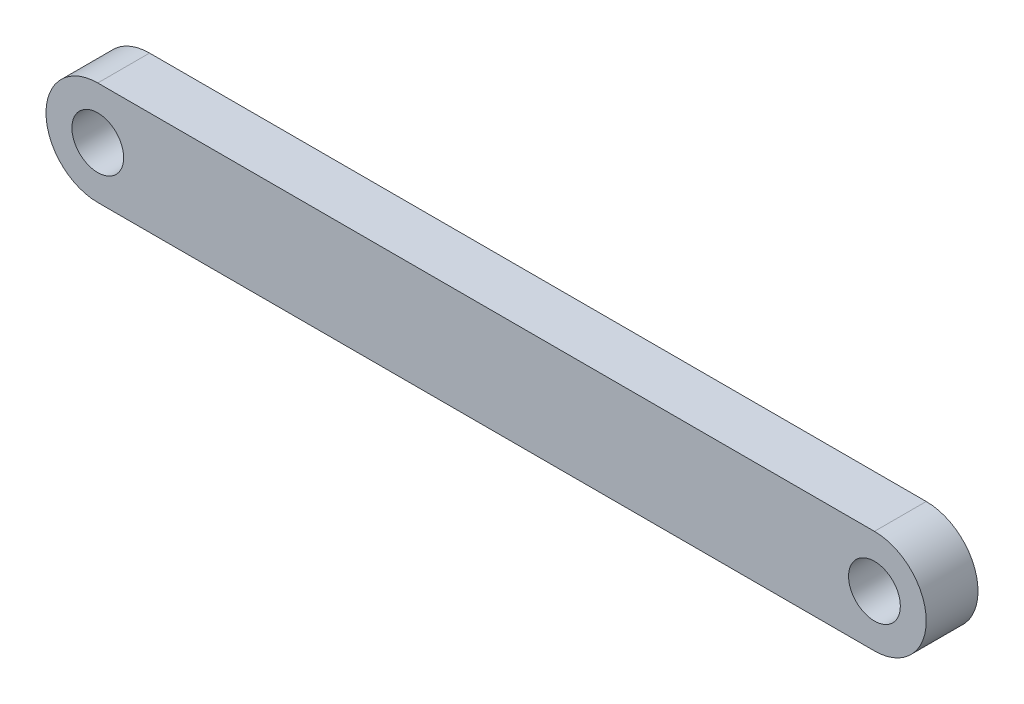
ISO-10303-21;
HEADER;
FILE_DESCRIPTION(('STEP AP214'),'2;1');
FILE_NAME('part.step','',(''),(''),'','','');
FILE_SCHEMA(('AUTOMOTIVE_DESIGN { 1 0 10303 214 1 1 1 1 }'));
ENDSEC;
DATA;
#1=APPLICATION_CONTEXT('core data for automotive mechanical design processes');
#2=APPLICATION_PROTOCOL_DEFINITION('international standard','automotive_design',2000,#1);
#3=PRODUCT_CONTEXT('',#1,'mechanical');
#4=PRODUCT('Part','Part','',(#3));
#5=PRODUCT_RELATED_PRODUCT_CATEGORY('part','',(#4));
#6=PRODUCT_DEFINITION_FORMATION('','',#4);
#7=PRODUCT_DEFINITION_CONTEXT('part definition',#1,'design');
#8=PRODUCT_DEFINITION('design','',#6,#7);
#9=PRODUCT_DEFINITION_SHAPE('','',#8);
#10=(LENGTH_UNIT() NAMED_UNIT(*) SI_UNIT(.MILLI.,.METRE.));
#11=(NAMED_UNIT(*) PLANE_ANGLE_UNIT() SI_UNIT($,.RADIAN.));
#12=(NAMED_UNIT(*) SI_UNIT($,.STERADIAN.) SOLID_ANGLE_UNIT());
#13=UNCERTAINTY_MEASURE_WITH_UNIT(LENGTH_MEASURE(1.E-05),#10,'distance_accuracy_value','');
#14=(GEOMETRIC_REPRESENTATION_CONTEXT(3) GLOBAL_UNCERTAINTY_ASSIGNED_CONTEXT((#13)) GLOBAL_UNIT_ASSIGNED_CONTEXT((#10,
#11,#12)) REPRESENTATION_CONTEXT('',''));
#15=CARTESIAN_POINT('',(0.,0.,0.));
#16=DIRECTION('',(0.,0.,1.));
#17=DIRECTION('',(1.,0.,0.));
#18=AXIS2_PLACEMENT_3D('',#15,#16,#17);
#19=CARTESIAN_POINT('',(-75.,0.,10.));
#20=DIRECTION('',(0.,0.,1.));
#21=DIRECTION('',(1.,0.,0.));
#22=AXIS2_PLACEMENT_3D('',#19,#20,#21);
#23=PLANE('',#22);
#24=CARTESIAN_POINT('',(75.,0.,10.));
#25=DIRECTION('',(0.,0.,1.));
#26=DIRECTION('',(1.,0.,0.));
#27=AXIS2_PLACEMENT_3D('',#24,#25,#26);
#28=CIRCLE('',#27,4.99999999999999);
#29=CARTESIAN_POINT('',(80.,0.,10.));
#30=VERTEX_POINT('',#29);
#31=EDGE_CURVE('E141',#30,#30,#28,.T.);
#32=ORIENTED_EDGE('',*,*,#31,.F.);
#33=EDGE_LOOP('',(#32));
#34=FACE_BOUND('',#33,.T.);
#35=CARTESIAN_POINT('',(-75.,0.,10.));
#36=DIRECTION('',(0.,0.,1.));
#37=DIRECTION('',(1.,0.,0.));
#38=AXIS2_PLACEMENT_3D('',#35,#36,#37);
#39=CIRCLE('',#38,10.);
#40=CARTESIAN_POINT('',(-75.,9.99999999999998,10.));
#41=VERTEX_POINT('',#40);
#42=CARTESIAN_POINT('',(-75.,-10.,10.));
#43=VERTEX_POINT('',#42);
#44=EDGE_CURVE('E120',#41,#43,#39,.T.);
#45=ORIENTED_EDGE('',*,*,#44,.T.);
#46=DIRECTION('',(1.,0.,0.));
#47=VECTOR('',#46,1.);
#48=CARTESIAN_POINT('',(-75.,-10.,10.));
#49=LINE('',#48,#47);
#50=CARTESIAN_POINT('',(75.,-10.,10.));
#51=VERTEX_POINT('',#50);
#52=EDGE_CURVE('E113',#43,#51,#49,.T.);
#53=ORIENTED_EDGE('',*,*,#52,.T.);
#54=CARTESIAN_POINT('',(75.,0.,10.));
#55=DIRECTION('',(0.,0.,1.));
#56=DIRECTION('',(1.,0.,0.));
#57=AXIS2_PLACEMENT_3D('',#54,#55,#56);
#58=CIRCLE('',#57,10.);
#59=CARTESIAN_POINT('',(75.,10.,10.));
#60=VERTEX_POINT('',#59);
#61=EDGE_CURVE('E119',#51,#60,#58,.T.);
#62=ORIENTED_EDGE('',*,*,#61,.T.);
#63=DIRECTION('',(1.,0.,0.));
#64=VECTOR('',#63,1.);
#65=CARTESIAN_POINT('',(-75.,9.99999999999998,10.));
#66=LINE('',#65,#64);
#67=EDGE_CURVE('E132',#41,#60,#66,.T.);
#68=ORIENTED_EDGE('',*,*,#67,.F.);
#69=EDGE_LOOP('',(#45,#53,#62,#68));
#70=FACE_BOUND('',#69,.T.);
#71=CARTESIAN_POINT('',(-75.,0.,10.));
#72=DIRECTION('',(0.,0.,1.));
#73=DIRECTION('',(1.,0.,0.));
#74=AXIS2_PLACEMENT_3D('',#71,#72,#73);
#75=CIRCLE('',#74,4.99999999999999);
#76=CARTESIAN_POINT('',(-70.,0.,10.));
#77=VERTEX_POINT('',#76);
#78=EDGE_CURVE('E161',#77,#77,#75,.T.);
#79=ORIENTED_EDGE('',*,*,#78,.F.);
#80=EDGE_LOOP('',(#79));
#81=FACE_BOUND('',#80,.T.);
#82=ADVANCED_FACE('F69',(#34,#70,#81),#23,.T.);
#83=CARTESIAN_POINT('',(-75.,0.,0.));
#84=DIRECTION('',(0.,0.,1.));
#85=DIRECTION('',(1.,0.,0.));
#86=AXIS2_PLACEMENT_3D('',#83,#84,#85);
#87=PLANE('',#86);
#88=CARTESIAN_POINT('',(-75.,0.,0.));
#89=DIRECTION('',(0.,0.,1.));
#90=DIRECTION('',(1.,0.,0.));
#91=AXIS2_PLACEMENT_3D('',#88,#89,#90);
#92=CIRCLE('',#91,10.);
#93=CARTESIAN_POINT('',(-75.,9.99999999999998,0.));
#94=VERTEX_POINT('',#93);
#95=CARTESIAN_POINT('',(-75.,-10.,0.));
#96=VERTEX_POINT('',#95);
#97=EDGE_CURVE('E138',#94,#96,#92,.T.);
#98=ORIENTED_EDGE('',*,*,#97,.F.);
#99=DIRECTION('',(1.,0.,0.));
#100=VECTOR('',#99,1.);
#101=CARTESIAN_POINT('',(-75.,9.99999999999998,0.));
#102=LINE('',#101,#100);
#103=CARTESIAN_POINT('',(75.,10.,0.));
#104=VERTEX_POINT('',#103);
#105=EDGE_CURVE('E147',#94,#104,#102,.T.);
#106=ORIENTED_EDGE('',*,*,#105,.T.);
#107=CARTESIAN_POINT('',(75.,0.,0.));
#108=DIRECTION('',(0.,0.,1.));
#109=DIRECTION('',(1.,0.,0.));
#110=AXIS2_PLACEMENT_3D('',#107,#108,#109);
#111=CIRCLE('',#110,10.);
#112=CARTESIAN_POINT('',(75.,-10.,0.));
#113=VERTEX_POINT('',#112);
#114=EDGE_CURVE('E144',#113,#104,#111,.T.);
#115=ORIENTED_EDGE('',*,*,#114,.F.);
#116=DIRECTION('',(1.,0.,0.));
#117=VECTOR('',#116,1.);
#118=CARTESIAN_POINT('',(-75.,-10.,0.));
#119=LINE('',#118,#117);
#120=EDGE_CURVE('E126',#96,#113,#119,.T.);
#121=ORIENTED_EDGE('',*,*,#120,.F.);
#122=EDGE_LOOP('',(#98,#106,#115,#121));
#123=FACE_BOUND('',#122,.T.);
#124=CARTESIAN_POINT('',(75.,0.,0.));
#125=DIRECTION('',(0.,0.,1.));
#126=DIRECTION('',(1.,0.,0.));
#127=AXIS2_PLACEMENT_3D('',#124,#125,#126);
#128=CIRCLE('',#127,4.99999999999999);
#129=CARTESIAN_POINT('',(80.,0.,0.));
#130=VERTEX_POINT('',#129);
#131=EDGE_CURVE('E157',#130,#130,#128,.T.);
#132=ORIENTED_EDGE('',*,*,#131,.T.);
#133=EDGE_LOOP('',(#132));
#134=FACE_BOUND('',#133,.T.);
#135=CARTESIAN_POINT('',(-75.,0.,0.));
#136=DIRECTION('',(0.,0.,1.));
#137=DIRECTION('',(1.,0.,0.));
#138=AXIS2_PLACEMENT_3D('',#135,#136,#137);
#139=CIRCLE('',#138,4.99999999999999);
#140=CARTESIAN_POINT('',(-70.,0.,0.));
#141=VERTEX_POINT('',#140);
#142=EDGE_CURVE('E165',#141,#141,#139,.T.);
#143=ORIENTED_EDGE('',*,*,#142,.T.);
#144=EDGE_LOOP('',(#143));
#145=FACE_BOUND('',#144,.T.);
#146=ADVANCED_FACE('F176',(#123,#134,#145),#87,.F.);
#147=CARTESIAN_POINT('',(-75.,0.,10.));
#148=DIRECTION('',(0.,0.,-1.));
#149=DIRECTION('',(-1.,0.,0.));
#150=AXIS2_PLACEMENT_3D('',#147,#148,#149);
#151=CYLINDRICAL_SURFACE('',#150,10.);
#152=ORIENTED_EDGE('',*,*,#97,.T.);
#153=DIRECTION('',(0.,0.,-1.));
#154=VECTOR('',#153,1.);
#155=CARTESIAN_POINT('',(-75.,-10.,10.));
#156=LINE('',#155,#154);
#157=EDGE_CURVE('E12',#43,#96,#156,.T.);
#158=ORIENTED_EDGE('',*,*,#157,.F.);
#159=ORIENTED_EDGE('',*,*,#44,.F.);
#160=DIRECTION('',(0.,0.,-1.));
#161=VECTOR('',#160,1.);
#162=CARTESIAN_POINT('',(-75.,9.99999999999998,10.));
#163=LINE('',#162,#161);
#164=EDGE_CURVE('E87',#41,#94,#163,.T.);
#165=ORIENTED_EDGE('',*,*,#164,.T.);
#166=EDGE_LOOP('',(#152,#158,#159,#165));
#167=FACE_BOUND('',#166,.T.);
#168=ADVANCED_FACE('F71',(#167),#151,.T.);
#169=CARTESIAN_POINT('',(-75.,-10.,10.));
#170=DIRECTION('',(0.,1.,0.));
#171=DIRECTION('',(0.,0.,1.));
#172=AXIS2_PLACEMENT_3D('',#169,#170,#171);
#173=PLANE('',#172);
#174=ORIENTED_EDGE('',*,*,#120,.T.);
#175=DIRECTION('',(0.,0.,-1.));
#176=VECTOR('',#175,1.);
#177=CARTESIAN_POINT('',(75.,-10.,10.));
#178=LINE('',#177,#176);
#179=EDGE_CURVE('E79',#51,#113,#178,.T.);
#180=ORIENTED_EDGE('',*,*,#179,.F.);
#181=ORIENTED_EDGE('',*,*,#52,.F.);
#182=ORIENTED_EDGE('',*,*,#157,.T.);
#183=EDGE_LOOP('',(#174,#180,#181,#182));
#184=FACE_BOUND('',#183,.T.);
#185=ADVANCED_FACE('F125',(#184),#173,.F.);
#186=CARTESIAN_POINT('',(75.,0.,10.));
#187=DIRECTION('',(0.,0.,-1.));
#188=DIRECTION('',(-1.,0.,0.));
#189=AXIS2_PLACEMENT_3D('',#186,#187,#188);
#190=CYLINDRICAL_SURFACE('',#189,10.);
#191=ORIENTED_EDGE('',*,*,#114,.T.);
#192=DIRECTION('',(0.,0.,-1.));
#193=VECTOR('',#192,1.);
#194=CARTESIAN_POINT('',(75.,10.,10.));
#195=LINE('',#194,#193);
#196=EDGE_CURVE('E102',#60,#104,#195,.T.);
#197=ORIENTED_EDGE('',*,*,#196,.F.);
#198=ORIENTED_EDGE('',*,*,#61,.F.);
#199=ORIENTED_EDGE('',*,*,#179,.T.);
#200=EDGE_LOOP('',(#191,#197,#198,#199));
#201=FACE_BOUND('',#200,.T.);
#202=ADVANCED_FACE('F130',(#201),#190,.T.);
#203=CARTESIAN_POINT('',(-75.,9.99999999999998,10.));
#204=DIRECTION('',(0.,1.,0.));
#205=DIRECTION('',(-1.,0.,0.));
#206=AXIS2_PLACEMENT_3D('',#203,#204,#205);
#207=PLANE('',#206);
#208=ORIENTED_EDGE('',*,*,#105,.F.);
#209=ORIENTED_EDGE('',*,*,#164,.F.);
#210=ORIENTED_EDGE('',*,*,#67,.T.);
#211=ORIENTED_EDGE('',*,*,#196,.T.);
#212=EDGE_LOOP('',(#208,#209,#210,#211));
#213=FACE_BOUND('',#212,.T.);
#214=ADVANCED_FACE('F188',(#213),#207,.T.);
#215=CARTESIAN_POINT('',(75.,0.,10.));
#216=DIRECTION('',(0.,0.,-1.));
#217=DIRECTION('',(-1.,0.,0.));
#218=AXIS2_PLACEMENT_3D('',#215,#216,#217);
#219=CYLINDRICAL_SURFACE('',#218,4.99999999999999);
#220=ORIENTED_EDGE('',*,*,#31,.T.);
#221=EDGE_LOOP('',(#220));
#222=FACE_BOUND('',#221,.T.);
#223=ORIENTED_EDGE('',*,*,#131,.F.);
#224=EDGE_LOOP('',(#223));
#225=FACE_BOUND('',#224,.T.);
#226=ADVANCED_FACE('F185',(#222,#225),#219,.F.);
#227=CARTESIAN_POINT('',(-75.,0.,10.));
#228=DIRECTION('',(0.,0.,-1.));
#229=DIRECTION('',(-1.,0.,0.));
#230=AXIS2_PLACEMENT_3D('',#227,#228,#229);
#231=CYLINDRICAL_SURFACE('',#230,4.99999999999999);
#232=ORIENTED_EDGE('',*,*,#78,.T.);
#233=EDGE_LOOP('',(#232));
#234=FACE_BOUND('',#233,.T.);
#235=ORIENTED_EDGE('',*,*,#142,.F.);
#236=EDGE_LOOP('',(#235));
#237=FACE_BOUND('',#236,.T.);
#238=ADVANCED_FACE('F173',(#234,#237),#231,.F.);
#239=CLOSED_SHELL('',(#82,#146,#168,#185,#202,#214,#226,#238));
#240=MANIFOLD_SOLID_BREP('B2',#239);
#241=ADVANCED_BREP_SHAPE_REPRESENTATION('',(#18,#240),#14);
#242=SHAPE_DEFINITION_REPRESENTATION(#9,#241);
ENDSEC;
END-ISO-10303-21;
